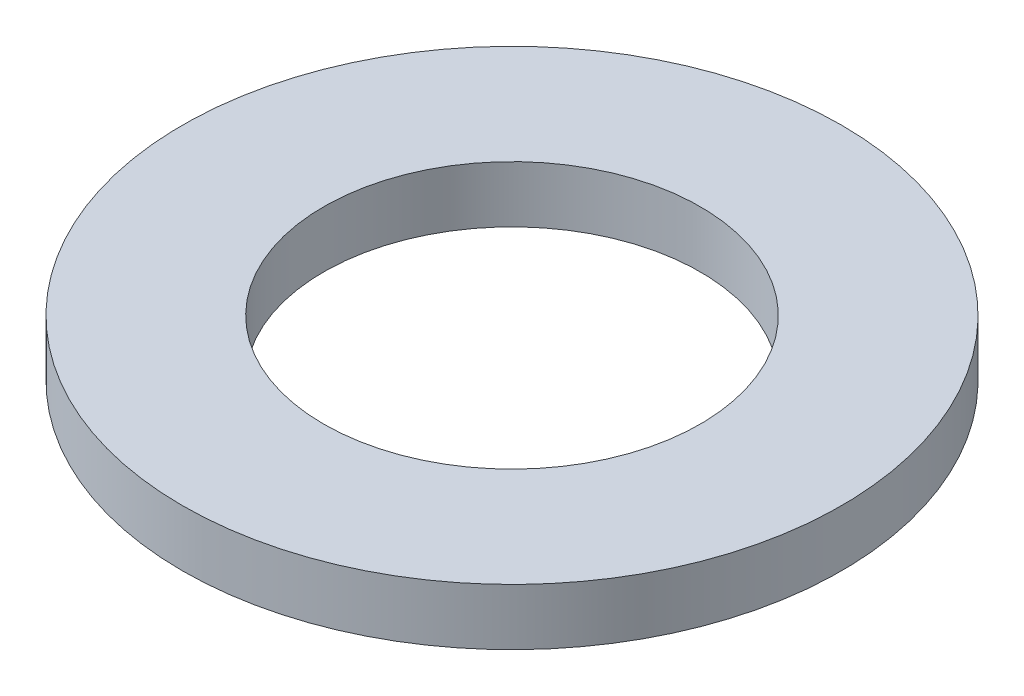
ISO-10303-21;
HEADER;
FILE_DESCRIPTION(('STEP AP214'),'2;1');
FILE_NAME('part.step','',(''),(''),'','','');
FILE_SCHEMA(('AUTOMOTIVE_DESIGN { 1 0 10303 214 1 1 1 1 }'));
ENDSEC;
DATA;
#1=APPLICATION_CONTEXT('core data for automotive mechanical design processes');
#2=APPLICATION_PROTOCOL_DEFINITION('international standard','automotive_design',2000,#1);
#3=PRODUCT_CONTEXT('',#1,'mechanical');
#4=PRODUCT('Part','Part','',(#3));
#5=PRODUCT_RELATED_PRODUCT_CATEGORY('part','',(#4));
#6=PRODUCT_DEFINITION_FORMATION('','',#4);
#7=PRODUCT_DEFINITION_CONTEXT('part definition',#1,'design');
#8=PRODUCT_DEFINITION('design','',#6,#7);
#9=PRODUCT_DEFINITION_SHAPE('','',#8);
#10=(LENGTH_UNIT() NAMED_UNIT(*) SI_UNIT(.MILLI.,.METRE.));
#11=(NAMED_UNIT(*) PLANE_ANGLE_UNIT() SI_UNIT($,.RADIAN.));
#12=(NAMED_UNIT(*) SI_UNIT($,.STERADIAN.) SOLID_ANGLE_UNIT());
#13=UNCERTAINTY_MEASURE_WITH_UNIT(LENGTH_MEASURE(1.E-05),#10,'distance_accuracy_value','');
#14=(GEOMETRIC_REPRESENTATION_CONTEXT(3) GLOBAL_UNCERTAINTY_ASSIGNED_CONTEXT((#13)) GLOBAL_UNIT_ASSIGNED_CONTEXT((#10,
#11,#12)) REPRESENTATION_CONTEXT('',''));
#15=CARTESIAN_POINT('',(0.,0.,0.));
#16=DIRECTION('',(0.,0.,1.));
#17=DIRECTION('',(1.,0.,0.));
#18=AXIS2_PLACEMENT_3D('',#15,#16,#17);
#19=CARTESIAN_POINT('',(0.,1.2,0.));
#20=DIRECTION('',(0.,1.,0.));
#21=DIRECTION('',(0.,0.,1.));
#22=AXIS2_PLACEMENT_3D('',#19,#20,#21);
#23=PLANE('',#22);
#24=CARTESIAN_POINT('',(0.,1.2,0.));
#25=DIRECTION('',(0.,1.,0.));
#26=DIRECTION('',(0.,0.,1.));
#27=AXIS2_PLACEMENT_3D('',#24,#25,#26);
#28=CIRCLE('',#27,7.);
#29=CARTESIAN_POINT('',(0.,1.2,7.));
#30=VERTEX_POINT('',#29);
#31=EDGE_CURVE('E10',#30,#30,#28,.T.);
#32=ORIENTED_EDGE('',*,*,#31,.T.);
#33=EDGE_LOOP('',(#32));
#34=FACE_BOUND('',#33,.T.);
#35=CARTESIAN_POINT('',(0.,1.2,0.));
#36=DIRECTION('',(0.,1.,0.));
#37=DIRECTION('',(0.,0.,1.));
#38=AXIS2_PLACEMENT_3D('',#35,#36,#37);
#39=CIRCLE('',#38,4.);
#40=CARTESIAN_POINT('',(0.,1.2,4.));
#41=VERTEX_POINT('',#40);
#42=EDGE_CURVE('E46',#41,#41,#39,.T.);
#43=ORIENTED_EDGE('',*,*,#42,.F.);
#44=EDGE_LOOP('',(#43));
#45=FACE_BOUND('',#44,.T.);
#46=ADVANCED_FACE('F35',(#34,#45),#23,.T.);
#47=CARTESIAN_POINT('',(0.,0.,0.));
#48=DIRECTION('',(0.,1.,0.));
#49=DIRECTION('',(0.,0.,1.));
#50=AXIS2_PLACEMENT_3D('',#47,#48,#49);
#51=PLANE('',#50);
#52=CARTESIAN_POINT('',(0.,0.,0.));
#53=DIRECTION('',(0.,1.,0.));
#54=DIRECTION('',(0.,0.,1.));
#55=AXIS2_PLACEMENT_3D('',#52,#53,#54);
#56=CIRCLE('',#55,7.);
#57=CARTESIAN_POINT('',(0.,0.,7.));
#58=VERTEX_POINT('',#57);
#59=EDGE_CURVE('E39',#58,#58,#56,.T.);
#60=ORIENTED_EDGE('',*,*,#59,.F.);
#61=EDGE_LOOP('',(#60));
#62=FACE_BOUND('',#61,.T.);
#63=CARTESIAN_POINT('',(0.,0.,0.));
#64=DIRECTION('',(0.,1.,0.));
#65=DIRECTION('',(0.,0.,1.));
#66=AXIS2_PLACEMENT_3D('',#63,#64,#65);
#67=CIRCLE('',#66,4.);
#68=CARTESIAN_POINT('',(0.,0.,4.));
#69=VERTEX_POINT('',#68);
#70=EDGE_CURVE('E48',#69,#69,#67,.T.);
#71=ORIENTED_EDGE('',*,*,#70,.T.);
#72=EDGE_LOOP('',(#71));
#73=FACE_BOUND('',#72,.T.);
#74=ADVANCED_FACE('F58',(#62,#73),#51,.F.);
#75=CARTESIAN_POINT('',(0.,1.2,0.));
#76=DIRECTION('',(0.,-1.,0.));
#77=DIRECTION('',(0.,0.,-1.));
#78=AXIS2_PLACEMENT_3D('',#75,#76,#77);
#79=CYLINDRICAL_SURFACE('',#78,7.);
#80=ORIENTED_EDGE('',*,*,#31,.F.);
#81=EDGE_LOOP('',(#80));
#82=FACE_BOUND('',#81,.T.);
#83=ORIENTED_EDGE('',*,*,#59,.T.);
#84=EDGE_LOOP('',(#83));
#85=FACE_BOUND('',#84,.T.);
#86=ADVANCED_FACE('F37',(#82,#85),#79,.T.);
#87=CARTESIAN_POINT('',(0.,1.2,0.));
#88=DIRECTION('',(0.,-1.,0.));
#89=DIRECTION('',(0.,0.,-1.));
#90=AXIS2_PLACEMENT_3D('',#87,#88,#89);
#91=CYLINDRICAL_SURFACE('',#90,4.);
#92=ORIENTED_EDGE('',*,*,#42,.T.);
#93=EDGE_LOOP('',(#92));
#94=FACE_BOUND('',#93,.T.);
#95=ORIENTED_EDGE('',*,*,#70,.F.);
#96=EDGE_LOOP('',(#95));
#97=FACE_BOUND('',#96,.T.);
#98=ADVANCED_FACE('F54',(#94,#97),#91,.F.);
#99=CLOSED_SHELL('',(#46,#74,#86,#98));
#100=MANIFOLD_SOLID_BREP('B2',#99);
#101=ADVANCED_BREP_SHAPE_REPRESENTATION('',(#18,#100),#14);
#102=SHAPE_DEFINITION_REPRESENTATION(#9,#101);
ENDSEC;
END-ISO-10303-21;
